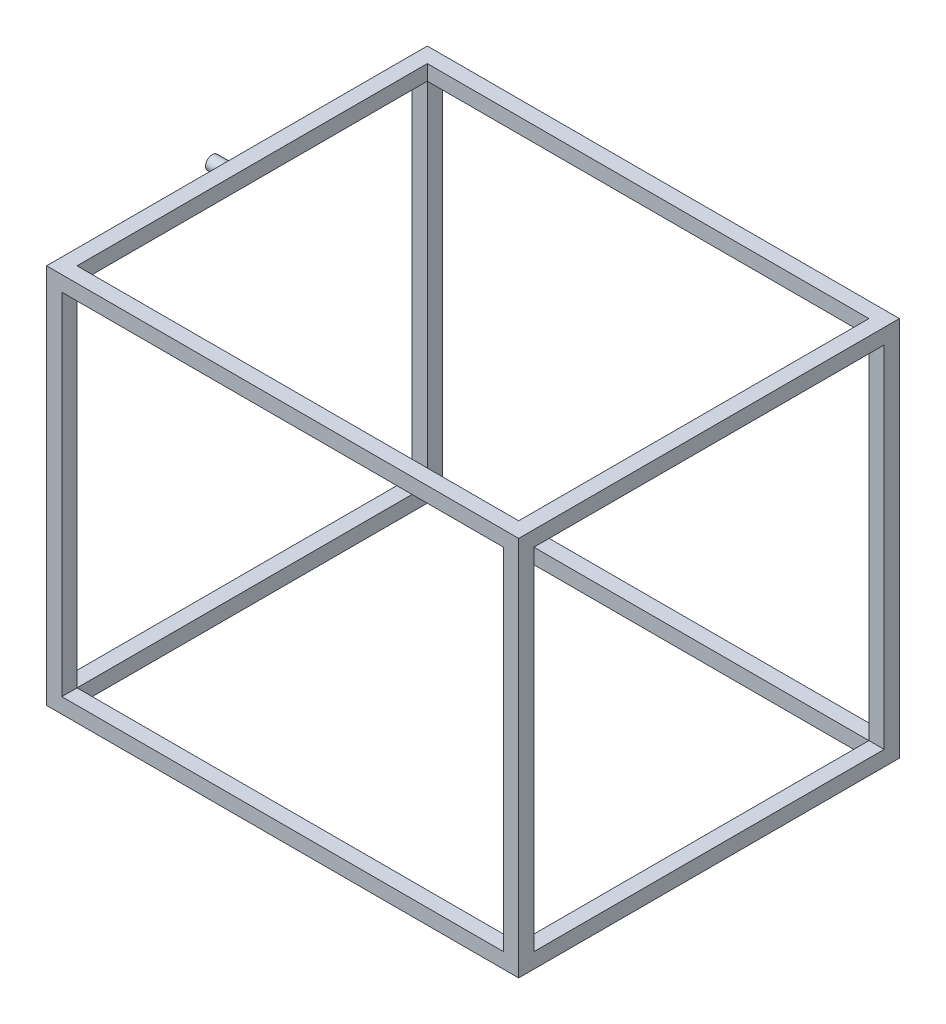
ISO-10303-21;
HEADER;
FILE_DESCRIPTION(('STEP AP214'),'2;1');
FILE_NAME('part.step','',(''),(''),'','','');
FILE_SCHEMA(('AUTOMOTIVE_DESIGN { 1 0 10303 214 1 1 1 1 }'));
ENDSEC;
DATA;
#1=APPLICATION_CONTEXT('core data for automotive mechanical design processes');
#2=APPLICATION_PROTOCOL_DEFINITION('international standard','automotive_design',2000,#1);
#3=PRODUCT_CONTEXT('',#1,'mechanical');
#4=PRODUCT('Part','Part','',(#3));
#5=PRODUCT_RELATED_PRODUCT_CATEGORY('part','',(#4));
#6=PRODUCT_DEFINITION_FORMATION('','',#4);
#7=PRODUCT_DEFINITION_CONTEXT('part definition',#1,'design');
#8=PRODUCT_DEFINITION('design','',#6,#7);
#9=PRODUCT_DEFINITION_SHAPE('','',#8);
#10=(LENGTH_UNIT() NAMED_UNIT(*) SI_UNIT(.MILLI.,.METRE.));
#11=(NAMED_UNIT(*) PLANE_ANGLE_UNIT() SI_UNIT($,.RADIAN.));
#12=(NAMED_UNIT(*) SI_UNIT($,.STERADIAN.) SOLID_ANGLE_UNIT());
#13=UNCERTAINTY_MEASURE_WITH_UNIT(LENGTH_MEASURE(1.E-05),#10,'distance_accuracy_value','');
#14=(GEOMETRIC_REPRESENTATION_CONTEXT(3) GLOBAL_UNCERTAINTY_ASSIGNED_CONTEXT((#13)) GLOBAL_UNIT_ASSIGNED_CONTEXT((#10,
#11,#12)) REPRESENTATION_CONTEXT('',''));
#15=CARTESIAN_POINT('',(0.,0.,0.));
#16=DIRECTION('',(0.,0.,1.));
#17=DIRECTION('',(1.,0.,0.));
#18=AXIS2_PLACEMENT_3D('',#15,#16,#17);
#19=CARTESIAN_POINT('',(0.,0.,500.));
#20=DIRECTION('',(0.,-1.,0.));
#21=DIRECTION('',(0.,0.,-1.));
#22=AXIS2_PLACEMENT_3D('',#19,#20,#21);
#23=PLANE('',#22);
#24=DIRECTION('',(1.,0.,0.));
#25=VECTOR('',#24,1.);
#26=CARTESIAN_POINT('',(-600.,0.,20.0000000000001));
#27=LINE('',#26,#25);
#28=CARTESIAN_POINT('',(-600.,0.,20.0000000000001));
#29=VERTEX_POINT('',#28);
#30=CARTESIAN_POINT('',(-580.,0.,20.));
#31=VERTEX_POINT('',#30);
#32=EDGE_CURVE('E216',#29,#31,#27,.T.);
#33=ORIENTED_EDGE('',*,*,#32,.F.);
#34=DIRECTION('',(0.,0.,-1.));
#35=VECTOR('',#34,1.);
#36=CARTESIAN_POINT('',(-600.,0.,0.));
#37=LINE('',#36,#35);
#38=CARTESIAN_POINT('',(-600.,0.,480.));
#39=VERTEX_POINT('',#38);
#40=EDGE_CURVE('E286',#39,#29,#37,.T.);
#41=ORIENTED_EDGE('',*,*,#40,.F.);
#42=DIRECTION('',(-1.,0.,0.));
#43=VECTOR('',#42,1.);
#44=CARTESIAN_POINT('',(-600.,0.,480.));
#45=LINE('',#44,#43);
#46=CARTESIAN_POINT('',(-580.,0.,480.));
#47=VERTEX_POINT('',#46);
#48=EDGE_CURVE('E229',#47,#39,#45,.T.);
#49=ORIENTED_EDGE('',*,*,#48,.F.);
#50=DIRECTION('',(0.,0.,-1.));
#51=VECTOR('',#50,1.);
#52=CARTESIAN_POINT('',(-580.,0.,0.));
#53=LINE('',#52,#51);
#54=EDGE_CURVE('E281',#47,#31,#53,.T.);
#55=ORIENTED_EDGE('',*,*,#54,.T.);
#56=EDGE_LOOP('',(#33,#41,#49,#55));
#57=FACE_BOUND('',#56,.T.);
#58=ADVANCED_FACE('F35',(#57),#23,.F.);
#59=DIRECTION('',(0.,0.,-1.));
#60=VECTOR('',#59,1.);
#61=CARTESIAN_POINT('',(-580.,0.,20.));
#62=LINE('',#61,#60);
#63=CARTESIAN_POINT('',(-580.,0.,0.));
#64=VERTEX_POINT('',#63);
#65=EDGE_CURVE('E212',#31,#64,#62,.T.);
#66=ORIENTED_EDGE('',*,*,#65,.F.);
#67=DIRECTION('',(1.,0.,0.));
#68=VECTOR('',#67,1.);
#69=CARTESIAN_POINT('',(-580.,0.,20.));
#70=LINE('',#69,#68);
#71=CARTESIAN_POINT('',(0.,0.,20.0000000000001));
#72=VERTEX_POINT('',#71);
#73=EDGE_CURVE('E296',#31,#72,#70,.T.);
#74=ORIENTED_EDGE('',*,*,#73,.T.);
#75=DIRECTION('',(0.,0.,1.));
#76=VECTOR('',#75,1.);
#77=CARTESIAN_POINT('',(0.,0.,0.));
#78=LINE('',#77,#76);
#79=CARTESIAN_POINT('',(0.,0.,0.));
#80=VERTEX_POINT('',#79);
#81=EDGE_CURVE('E255',#80,#72,#78,.T.);
#82=ORIENTED_EDGE('',*,*,#81,.F.);
#83=DIRECTION('',(-1.,0.,0.));
#84=VECTOR('',#83,1.);
#85=CARTESIAN_POINT('',(0.,0.,0.));
#86=LINE('',#85,#84);
#87=EDGE_CURVE('E320',#80,#64,#86,.T.);
#88=ORIENTED_EDGE('',*,*,#87,.T.);
#89=EDGE_LOOP('',(#66,#74,#82,#88));
#90=FACE_BOUND('',#89,.T.);
#91=ADVANCED_FACE('F406',(#90),#23,.F.);
#92=DIRECTION('',(0.,0.,-1.));
#93=VECTOR('',#92,1.);
#94=CARTESIAN_POINT('',(-580.,0.,480.));
#95=LINE('',#94,#93);
#96=CARTESIAN_POINT('',(-580.,0.,500.));
#97=VERTEX_POINT('',#96);
#98=EDGE_CURVE('E225',#97,#47,#95,.T.);
#99=ORIENTED_EDGE('',*,*,#98,.F.);
#100=DIRECTION('',(-1.,0.,0.));
#101=VECTOR('',#100,1.);
#102=CARTESIAN_POINT('',(0.,0.,500.));
#103=LINE('',#102,#101);
#104=CARTESIAN_POINT('',(0.,0.,500.));
#105=VERTEX_POINT('',#104);
#106=EDGE_CURVE('E322',#105,#97,#103,.T.);
#107=ORIENTED_EDGE('',*,*,#106,.F.);
#108=DIRECTION('',(0.,0.,1.));
#109=VECTOR('',#108,1.);
#110=CARTESIAN_POINT('',(0.,0.,500.));
#111=LINE('',#110,#109);
#112=CARTESIAN_POINT('',(0.,0.,480.));
#113=VERTEX_POINT('',#112);
#114=EDGE_CURVE('E244',#113,#105,#111,.T.);
#115=ORIENTED_EDGE('',*,*,#114,.F.);
#116=DIRECTION('',(1.,0.,0.));
#117=VECTOR('',#116,1.);
#118=CARTESIAN_POINT('',(-580.,0.,480.));
#119=LINE('',#118,#117);
#120=EDGE_CURVE('E313',#47,#113,#119,.T.);
#121=ORIENTED_EDGE('',*,*,#120,.F.);
#122=EDGE_LOOP('',(#99,#107,#115,#121));
#123=FACE_BOUND('',#122,.T.);
#124=ADVANCED_FACE('F413',(#123),#23,.F.);
#125=DIRECTION('',(-1.,0.,0.));
#126=VECTOR('',#125,1.);
#127=CARTESIAN_POINT('',(0.,0.,480.));
#128=LINE('',#127,#126);
#129=CARTESIAN_POINT('',(20.,0.,480.));
#130=VERTEX_POINT('',#129);
#131=EDGE_CURVE('E239',#130,#113,#128,.T.);
#132=ORIENTED_EDGE('',*,*,#131,.F.);
#133=DIRECTION('',(0.,0.,-1.));
#134=VECTOR('',#133,1.);
#135=CARTESIAN_POINT('',(20.,0.,500.));
#136=LINE('',#135,#134);
#137=CARTESIAN_POINT('',(20.,0.,20.0000000000001));
#138=VERTEX_POINT('',#137);
#139=EDGE_CURVE('E332',#130,#138,#136,.T.);
#140=ORIENTED_EDGE('',*,*,#139,.T.);
#141=DIRECTION('',(1.,0.,0.));
#142=VECTOR('',#141,1.);
#143=CARTESIAN_POINT('',(0.,0.,20.0000000000001));
#144=LINE('',#143,#142);
#145=EDGE_CURVE('E260',#72,#138,#144,.T.);
#146=ORIENTED_EDGE('',*,*,#145,.F.);
#147=DIRECTION('',(0.,0.,-1.));
#148=VECTOR('',#147,1.);
#149=CARTESIAN_POINT('',(0.,0.,500.));
#150=LINE('',#149,#148);
#151=EDGE_CURVE('E324',#113,#72,#150,.T.);
#152=ORIENTED_EDGE('',*,*,#151,.F.);
#153=EDGE_LOOP('',(#132,#140,#146,#152));
#154=FACE_BOUND('',#153,.T.);
#155=ADVANCED_FACE('F409',(#154),#23,.F.);
#156=CARTESIAN_POINT('',(0.,0.,500.));
#157=DIRECTION('',(1.,0.,0.));
#158=DIRECTION('',(0.,1.,0.));
#159=AXIS2_PLACEMENT_3D('',#156,#157,#158);
#160=PLANE('',#159);
#161=DIRECTION('',(0.,1.,0.));
#162=VECTOR('',#161,1.);
#163=CARTESIAN_POINT('',(0.,0.,20.));
#164=LINE('',#163,#162);
#165=CARTESIAN_POINT('',(0.,-20.,20.0000000000001));
#166=VERTEX_POINT('',#165);
#167=EDGE_CURVE('E288',#166,#72,#164,.T.);
#168=ORIENTED_EDGE('',*,*,#167,.F.);
#169=DIRECTION('',(0.,0.,-1.));
#170=VECTOR('',#169,1.);
#171=CARTESIAN_POINT('',(0.,-20.,500.));
#172=LINE('',#171,#170);
#173=CARTESIAN_POINT('',(0.,-20.,480.));
#174=VERTEX_POINT('',#173);
#175=EDGE_CURVE('E11',#174,#166,#172,.T.);
#176=ORIENTED_EDGE('',*,*,#175,.F.);
#177=DIRECTION('',(0.,-1.,0.));
#178=VECTOR('',#177,1.);
#179=CARTESIAN_POINT('',(0.,0.,480.));
#180=LINE('',#179,#178);
#181=EDGE_CURVE('E304',#113,#174,#180,.T.);
#182=ORIENTED_EDGE('',*,*,#181,.F.);
#183=ORIENTED_EDGE('',*,*,#151,.T.);
#184=EDGE_LOOP('',(#168,#176,#182,#183));
#185=FACE_BOUND('',#184,.T.);
#186=ADVANCED_FACE('F37',(#185),#160,.F.);
#187=CARTESIAN_POINT('',(0.,-20.,500.));
#188=DIRECTION('',(0.,1.,0.));
#189=DIRECTION('',(0.,0.,1.));
#190=AXIS2_PLACEMENT_3D('',#187,#188,#189);
#191=PLANE('',#190);
#192=DIRECTION('',(1.,0.,0.));
#193=VECTOR('',#192,1.);
#194=CARTESIAN_POINT('',(0.,-20.,500.));
#195=LINE('',#194,#193);
#196=CARTESIAN_POINT('',(-600.,-20.0000000000001,500.));
#197=VERTEX_POINT('',#196);
#198=CARTESIAN_POINT('',(20.,-20.,500.));
#199=VERTEX_POINT('',#198);
#200=EDGE_CURVE('E317',#197,#199,#195,.T.);
#201=ORIENTED_EDGE('',*,*,#200,.F.);
#202=DIRECTION('',(0.,0.,1.));
#203=VECTOR('',#202,1.);
#204=CARTESIAN_POINT('',(-600.,-20.0000000000001,500.));
#205=LINE('',#204,#203);
#206=CARTESIAN_POINT('',(-600.,-20.0000000000001,0.));
#207=VERTEX_POINT('',#206);
#208=EDGE_CURVE('E280',#207,#197,#205,.T.);
#209=ORIENTED_EDGE('',*,*,#208,.F.);
#210=DIRECTION('',(1.,0.,0.));
#211=VECTOR('',#210,1.);
#212=CARTESIAN_POINT('',(0.,-20.,0.));
#213=LINE('',#212,#211);
#214=CARTESIAN_POINT('',(20.,-20.,0.));
#215=VERTEX_POINT('',#214);
#216=EDGE_CURVE('E316',#207,#215,#213,.T.);
#217=ORIENTED_EDGE('',*,*,#216,.T.);
#218=DIRECTION('',(0.,0.,-1.));
#219=VECTOR('',#218,1.);
#220=CARTESIAN_POINT('',(20.,-20.,500.));
#221=LINE('',#220,#219);
#222=EDGE_CURVE('E43',#199,#215,#221,.T.);
#223=ORIENTED_EDGE('',*,*,#222,.F.);
#224=EDGE_LOOP('',(#201,#209,#217,#223));
#225=FACE_BOUND('',#224,.T.);
#226=DIRECTION('',(0.,0.,1.));
#227=VECTOR('',#226,1.);
#228=CARTESIAN_POINT('',(-580.,-20.0000000000001,500.));
#229=LINE('',#228,#227);
#230=CARTESIAN_POINT('',(-580.,-20.0000000000001,20.));
#231=VERTEX_POINT('',#230);
#232=CARTESIAN_POINT('',(-580.,-20.0000000000001,480.));
#233=VERTEX_POINT('',#232);
#234=EDGE_CURVE('E276',#231,#233,#229,.T.);
#235=ORIENTED_EDGE('',*,*,#234,.T.);
#236=DIRECTION('',(1.,0.,0.));
#237=VECTOR('',#236,1.);
#238=CARTESIAN_POINT('',(-580.,-20.0000000000001,480.));
#239=LINE('',#238,#237);
#240=EDGE_CURVE('E308',#233,#174,#239,.T.);
#241=ORIENTED_EDGE('',*,*,#240,.T.);
#242=ORIENTED_EDGE('',*,*,#175,.T.);
#243=DIRECTION('',(1.,0.,0.));
#244=VECTOR('',#243,1.);
#245=CARTESIAN_POINT('',(-580.,-20.0000000000001,20.));
#246=LINE('',#245,#244);
#247=EDGE_CURVE('E301',#231,#166,#246,.T.);
#248=ORIENTED_EDGE('',*,*,#247,.F.);
#249=EDGE_LOOP('',(#235,#241,#242,#248));
#250=FACE_BOUND('',#249,.T.);
#251=ADVANCED_FACE('F424',(#225,#250),#191,.F.);
#252=CARTESIAN_POINT('',(20.,0.,500.));
#253=DIRECTION('',(-1.,0.,0.));
#254=DIRECTION('',(0.,0.,1.));
#255=AXIS2_PLACEMENT_3D('',#252,#253,#254);
#256=PLANE('',#255);
#257=DIRECTION('',(0.,1.,0.));
#258=VECTOR('',#257,1.);
#259=CARTESIAN_POINT('',(20.,0.,0.));
#260=LINE('',#259,#258);
#261=CARTESIAN_POINT('',(20.,480.,0.));
#262=VERTEX_POINT('',#261);
#263=EDGE_CURVE('E326',#215,#262,#260,.T.);
#264=ORIENTED_EDGE('',*,*,#263,.T.);
#265=DIRECTION('',(0.,0.,-1.));
#266=VECTOR('',#265,1.);
#267=CARTESIAN_POINT('',(20.,480.,0.));
#268=LINE('',#267,#266);
#269=CARTESIAN_POINT('',(20.,480.,500.));
#270=VERTEX_POINT('',#269);
#271=EDGE_CURVE('E351',#270,#262,#268,.T.);
#272=ORIENTED_EDGE('',*,*,#271,.F.);
#273=DIRECTION('',(0.,1.,0.));
#274=VECTOR('',#273,1.);
#275=CARTESIAN_POINT('',(20.,0.,500.));
#276=LINE('',#275,#274);
#277=EDGE_CURVE('E319',#199,#270,#276,.T.);
#278=ORIENTED_EDGE('',*,*,#277,.F.);
#279=ORIENTED_EDGE('',*,*,#222,.T.);
#280=EDGE_LOOP('',(#264,#272,#278,#279));
#281=FACE_BOUND('',#280,.T.);
#282=DIRECTION('',(0.,0.,-1.));
#283=VECTOR('',#282,1.);
#284=CARTESIAN_POINT('',(20.,460.,0.));
#285=LINE('',#284,#283);
#286=CARTESIAN_POINT('',(20.,460.,480.));
#287=VERTEX_POINT('',#286);
#288=CARTESIAN_POINT('',(20.,460.,20.0000000000001));
#289=VERTEX_POINT('',#288);
#290=EDGE_CURVE('E202',#287,#289,#285,.T.);
#291=ORIENTED_EDGE('',*,*,#290,.T.);
#292=DIRECTION('',(0.,-1.,0.));
#293=VECTOR('',#292,1.);
#294=CARTESIAN_POINT('',(20.,460.,20.0000000000001));
#295=LINE('',#294,#293);
#296=EDGE_CURVE('E270',#289,#138,#295,.T.);
#297=ORIENTED_EDGE('',*,*,#296,.T.);
#298=ORIENTED_EDGE('',*,*,#139,.F.);
#299=DIRECTION('',(0.,-1.,0.));
#300=VECTOR('',#299,1.);
#301=CARTESIAN_POINT('',(20.,460.,480.));
#302=LINE('',#301,#300);
#303=EDGE_CURVE('E253',#287,#130,#302,.T.);
#304=ORIENTED_EDGE('',*,*,#303,.F.);
#305=EDGE_LOOP('',(#291,#297,#298,#304));
#306=FACE_BOUND('',#305,.T.);
#307=ADVANCED_FACE('F338',(#281,#306),#256,.F.);
#308=CARTESIAN_POINT('',(0.,0.,500.));
#309=DIRECTION('',(0.,0.,1.));
#310=DIRECTION('',(1.,0.,0.));
#311=AXIS2_PLACEMENT_3D('',#308,#309,#310);
#312=PLANE('',#311);
#313=ORIENTED_EDGE('',*,*,#277,.T.);
#314=DIRECTION('',(1.,0.,0.));
#315=VECTOR('',#314,1.);
#316=CARTESIAN_POINT('',(20.,480.,500.));
#317=LINE('',#316,#315);
#318=CARTESIAN_POINT('',(-600.,480.,500.));
#319=VERTEX_POINT('',#318);
#320=EDGE_CURVE('E352',#319,#270,#317,.T.);
#321=ORIENTED_EDGE('',*,*,#320,.F.);
#322=DIRECTION('',(0.,1.,0.));
#323=VECTOR('',#322,1.);
#324=CARTESIAN_POINT('',(-600.,0.,500.));
#325=LINE('',#324,#323);
#326=EDGE_CURVE('E284',#197,#319,#325,.T.);
#327=ORIENTED_EDGE('',*,*,#326,.F.);
#328=ORIENTED_EDGE('',*,*,#200,.T.);
#329=EDGE_LOOP('',(#313,#321,#327,#328));
#330=FACE_BOUND('',#329,.T.);
#331=DIRECTION('',(1.,0.,0.));
#332=VECTOR('',#331,1.);
#333=CARTESIAN_POINT('',(20.,460.,500.));
#334=LINE('',#333,#332);
#335=CARTESIAN_POINT('',(-580.,460.,500.));
#336=VERTEX_POINT('',#335);
#337=CARTESIAN_POINT('',(0.,460.,500.));
#338=VERTEX_POINT('',#337);
#339=EDGE_CURVE('E185',#336,#338,#334,.T.);
#340=ORIENTED_EDGE('',*,*,#339,.T.);
#341=DIRECTION('',(0.,-1.,0.));
#342=VECTOR('',#341,1.);
#343=CARTESIAN_POINT('',(0.,460.,500.));
#344=LINE('',#343,#342);
#345=EDGE_CURVE('E58',#338,#105,#344,.T.);
#346=ORIENTED_EDGE('',*,*,#345,.T.);
#347=ORIENTED_EDGE('',*,*,#106,.T.);
#348=DIRECTION('',(0.,-1.,0.));
#349=VECTOR('',#348,1.);
#350=CARTESIAN_POINT('',(-580.,460.,500.));
#351=LINE('',#350,#349);
#352=EDGE_CURVE('E237',#336,#97,#351,.T.);
#353=ORIENTED_EDGE('',*,*,#352,.F.);
#354=EDGE_LOOP('',(#340,#346,#347,#353));
#355=FACE_BOUND('',#354,.T.);
#356=ADVANCED_FACE('F493',(#330,#355),#312,.T.);
#357=CARTESIAN_POINT('',(0.,0.,0.));
#358=DIRECTION('',(0.,0.,1.));
#359=DIRECTION('',(1.,0.,0.));
#360=AXIS2_PLACEMENT_3D('',#357,#358,#359);
#361=PLANE('',#360);
#362=DIRECTION('',(0.,-1.,0.));
#363=VECTOR('',#362,1.);
#364=CARTESIAN_POINT('',(0.,460.,0.));
#365=LINE('',#364,#363);
#366=CARTESIAN_POINT('',(0.,460.,0.));
#367=VERTEX_POINT('',#366);
#368=EDGE_CURVE('E263',#367,#80,#365,.T.);
#369=ORIENTED_EDGE('',*,*,#368,.F.);
#370=DIRECTION('',(-1.,0.,0.));
#371=VECTOR('',#370,1.);
#372=CARTESIAN_POINT('',(-600.,460.,0.));
#373=LINE('',#372,#371);
#374=CARTESIAN_POINT('',(-580.,460.,0.));
#375=VERTEX_POINT('',#374);
#376=EDGE_CURVE('E205',#367,#375,#373,.T.);
#377=ORIENTED_EDGE('',*,*,#376,.T.);
#378=DIRECTION('',(0.,-1.,0.));
#379=VECTOR('',#378,1.);
#380=CARTESIAN_POINT('',(-580.,460.,0.));
#381=LINE('',#380,#379);
#382=EDGE_CURVE('E215',#375,#64,#381,.T.);
#383=ORIENTED_EDGE('',*,*,#382,.T.);
#384=ORIENTED_EDGE('',*,*,#87,.F.);
#385=EDGE_LOOP('',(#369,#377,#383,#384));
#386=FACE_BOUND('',#385,.T.);
#387=ORIENTED_EDGE('',*,*,#216,.F.);
#388=DIRECTION('',(0.,-1.,0.));
#389=VECTOR('',#388,1.);
#390=CARTESIAN_POINT('',(-600.,-20.0000000000001,0.));
#391=LINE('',#390,#389);
#392=CARTESIAN_POINT('',(-600.,480.,0.));
#393=VERTEX_POINT('',#392);
#394=EDGE_CURVE('E277',#393,#207,#391,.T.);
#395=ORIENTED_EDGE('',*,*,#394,.F.);
#396=DIRECTION('',(-1.,0.,0.));
#397=VECTOR('',#396,1.);
#398=CARTESIAN_POINT('',(-600.,480.,0.));
#399=LINE('',#398,#397);
#400=EDGE_CURVE('E199',#262,#393,#399,.T.);
#401=ORIENTED_EDGE('',*,*,#400,.F.);
#402=ORIENTED_EDGE('',*,*,#263,.F.);
#403=EDGE_LOOP('',(#387,#395,#401,#402));
#404=FACE_BOUND('',#403,.T.);
#405=ADVANCED_FACE('F345',(#386,#404),#361,.F.);
#406=CARTESIAN_POINT('',(-580.,0.,480.));
#407=DIRECTION('',(0.,0.,1.));
#408=DIRECTION('',(1.,0.,0.));
#409=AXIS2_PLACEMENT_3D('',#406,#407,#408);
#410=PLANE('',#409);
#411=ORIENTED_EDGE('',*,*,#181,.T.);
#412=ORIENTED_EDGE('',*,*,#240,.F.);
#413=DIRECTION('',(0.,-1.,0.));
#414=VECTOR('',#413,1.);
#415=CARTESIAN_POINT('',(-580.,0.,480.));
#416=LINE('',#415,#414);
#417=EDGE_CURVE('E305',#47,#233,#416,.T.);
#418=ORIENTED_EDGE('',*,*,#417,.F.);
#419=ORIENTED_EDGE('',*,*,#120,.T.);
#420=EDGE_LOOP('',(#411,#412,#418,#419));
#421=FACE_BOUND('',#420,.T.);
#422=ADVANCED_FACE('F482',(#421),#410,.F.);
#423=CARTESIAN_POINT('',(-580.,0.,20.));
#424=DIRECTION('',(0.,0.,-1.));
#425=DIRECTION('',(0.,1.,0.));
#426=AXIS2_PLACEMENT_3D('',#423,#424,#425);
#427=PLANE('',#426);
#428=ORIENTED_EDGE('',*,*,#167,.T.);
#429=ORIENTED_EDGE('',*,*,#73,.F.);
#430=DIRECTION('',(0.,1.,0.));
#431=VECTOR('',#430,1.);
#432=CARTESIAN_POINT('',(-580.,0.,20.));
#433=LINE('',#432,#431);
#434=EDGE_CURVE('E293',#231,#31,#433,.T.);
#435=ORIENTED_EDGE('',*,*,#434,.F.);
#436=ORIENTED_EDGE('',*,*,#247,.T.);
#437=EDGE_LOOP('',(#428,#429,#435,#436));
#438=FACE_BOUND('',#437,.T.);
#439=ADVANCED_FACE('F471',(#438),#427,.F.);
#440=CARTESIAN_POINT('',(-580.,0.,0.));
#441=DIRECTION('',(1.,0.,0.));
#442=DIRECTION('',(0.,0.,-1.));
#443=AXIS2_PLACEMENT_3D('',#440,#441,#442);
#444=PLANE('',#443);
#445=ORIENTED_EDGE('',*,*,#417,.T.);
#446=ORIENTED_EDGE('',*,*,#234,.F.);
#447=ORIENTED_EDGE('',*,*,#434,.T.);
#448=ORIENTED_EDGE('',*,*,#54,.F.);
#449=EDGE_LOOP('',(#445,#446,#447,#448));
#450=FACE_BOUND('',#449,.T.);
#451=ADVANCED_FACE('F475',(#450),#444,.T.);
#452=CARTESIAN_POINT('',(-600.,0.,0.));
#453=DIRECTION('',(1.,0.,0.));
#454=DIRECTION('',(0.,0.,-1.));
#455=AXIS2_PLACEMENT_3D('',#452,#453,#454);
#456=PLANE('',#455);
#457=ORIENTED_EDGE('',*,*,#326,.T.);
#458=DIRECTION('',(0.,0.,1.));
#459=VECTOR('',#458,1.);
#460=CARTESIAN_POINT('',(-600.,480.,500.));
#461=LINE('',#460,#459);
#462=EDGE_CURVE('E208',#393,#319,#461,.T.);
#463=ORIENTED_EDGE('',*,*,#462,.F.);
#464=ORIENTED_EDGE('',*,*,#394,.T.);
#465=ORIENTED_EDGE('',*,*,#208,.T.);
#466=EDGE_LOOP('',(#457,#463,#464,#465));
#467=FACE_BOUND('',#466,.T.);
#468=DIRECTION('',(0.,0.,1.));
#469=VECTOR('',#468,1.);
#470=CARTESIAN_POINT('',(-600.,460.,500.));
#471=LINE('',#470,#469);
#472=CARTESIAN_POINT('',(-600.,460.,20.0000000000001));
#473=VERTEX_POINT('',#472);
#474=CARTESIAN_POINT('',(-600.,460.,262.359920907128));
#475=VERTEX_POINT('',#474);
#476=EDGE_CURVE('E176',#473,#475,#471,.T.);
#477=ORIENTED_EDGE('',*,*,#476,.T.);
#478=CARTESIAN_POINT('',(-600.,468.864055169814,262.359920907128));
#479=DIRECTION('',(-1.,0.,0.));
#480=DIRECTION('',(0.,0.,1.));
#481=AXIS2_PLACEMENT_3D('',#478,#479,#480);
#482=CIRCLE('',#481,8.86405516981353);
#483=EDGE_CURVE('E180',#475,#475,#482,.T.);
#484=ORIENTED_EDGE('',*,*,#483,.F.);
#485=CARTESIAN_POINT('',(-600.,460.,480.));
#486=VERTEX_POINT('',#485);
#487=EDGE_CURVE('E186',#475,#486,#471,.T.);
#488=ORIENTED_EDGE('',*,*,#487,.T.);
#489=DIRECTION('',(0.,-1.,0.));
#490=VECTOR('',#489,1.);
#491=CARTESIAN_POINT('',(-600.,460.,480.));
#492=LINE('',#491,#490);
#493=EDGE_CURVE('E50',#486,#39,#492,.T.);
#494=ORIENTED_EDGE('',*,*,#493,.T.);
#495=ORIENTED_EDGE('',*,*,#40,.T.);
#496=DIRECTION('',(0.,-1.,0.));
#497=VECTOR('',#496,1.);
#498=CARTESIAN_POINT('',(-600.,460.,20.0000000000001));
#499=LINE('',#498,#497);
#500=EDGE_CURVE('E181',#473,#29,#499,.T.);
#501=ORIENTED_EDGE('',*,*,#500,.F.);
#502=EDGE_LOOP('',(#477,#484,#488,#494,#495,#501));
#503=FACE_BOUND('',#502,.T.);
#504=ADVANCED_FACE('F178',(#467,#503),#456,.F.);
#505=CARTESIAN_POINT('',(0.,460.,0.));
#506=DIRECTION('',(1.,0.,0.));
#507=DIRECTION('',(0.,0.,-1.));
#508=AXIS2_PLACEMENT_3D('',#505,#506,#507);
#509=PLANE('',#508);
#510=ORIENTED_EDGE('',*,*,#81,.T.);
#511=DIRECTION('',(0.,-1.,0.));
#512=VECTOR('',#511,1.);
#513=CARTESIAN_POINT('',(0.,460.,20.0000000000001));
#514=LINE('',#513,#512);
#515=CARTESIAN_POINT('',(0.,460.,20.0000000000001));
#516=VERTEX_POINT('',#515);
#517=EDGE_CURVE('E273',#516,#72,#514,.T.);
#518=ORIENTED_EDGE('',*,*,#517,.F.);
#519=DIRECTION('',(0.,0.,1.));
#520=VECTOR('',#519,1.);
#521=CARTESIAN_POINT('',(0.,460.,0.));
#522=LINE('',#521,#520);
#523=EDGE_CURVE('E256',#367,#516,#522,.T.);
#524=ORIENTED_EDGE('',*,*,#523,.F.);
#525=ORIENTED_EDGE('',*,*,#368,.T.);
#526=EDGE_LOOP('',(#510,#518,#524,#525));
#527=FACE_BOUND('',#526,.T.);
#528=ADVANCED_FACE('F464',(#527),#509,.F.);
#529=CARTESIAN_POINT('',(0.,460.,20.0000000000001));
#530=DIRECTION('',(0.,0.,-1.));
#531=DIRECTION('',(-1.,0.,0.));
#532=AXIS2_PLACEMENT_3D('',#529,#530,#531);
#533=PLANE('',#532);
#534=ORIENTED_EDGE('',*,*,#145,.T.);
#535=ORIENTED_EDGE('',*,*,#296,.F.);
#536=DIRECTION('',(1.,0.,0.));
#537=VECTOR('',#536,1.);
#538=CARTESIAN_POINT('',(0.,460.,20.0000000000001));
#539=LINE('',#538,#537);
#540=EDGE_CURVE('E259',#516,#289,#539,.T.);
#541=ORIENTED_EDGE('',*,*,#540,.F.);
#542=ORIENTED_EDGE('',*,*,#517,.T.);
#543=EDGE_LOOP('',(#534,#535,#541,#542));
#544=FACE_BOUND('',#543,.T.);
#545=ADVANCED_FACE('F434',(#544),#533,.F.);
#546=CARTESIAN_POINT('',(0.,460.,480.));
#547=DIRECTION('',(0.,0.,1.));
#548=DIRECTION('',(1.,0.,0.));
#549=AXIS2_PLACEMENT_3D('',#546,#547,#548);
#550=PLANE('',#549);
#551=ORIENTED_EDGE('',*,*,#131,.T.);
#552=DIRECTION('',(0.,-1.,0.));
#553=VECTOR('',#552,1.);
#554=CARTESIAN_POINT('',(0.,460.,480.));
#555=LINE('',#554,#553);
#556=CARTESIAN_POINT('',(0.,460.,480.));
#557=VERTEX_POINT('',#556);
#558=EDGE_CURVE('E250',#557,#113,#555,.T.);
#559=ORIENTED_EDGE('',*,*,#558,.F.);
#560=DIRECTION('',(-1.,0.,0.));
#561=VECTOR('',#560,1.);
#562=CARTESIAN_POINT('',(0.,460.,480.));
#563=LINE('',#562,#561);
#564=EDGE_CURVE('E240',#287,#557,#563,.T.);
#565=ORIENTED_EDGE('',*,*,#564,.F.);
#566=ORIENTED_EDGE('',*,*,#303,.T.);
#567=EDGE_LOOP('',(#551,#559,#565,#566));
#568=FACE_BOUND('',#567,.T.);
#569=ADVANCED_FACE('F530',(#568),#550,.F.);
#570=CARTESIAN_POINT('',(0.,460.,500.));
#571=DIRECTION('',(1.,0.,0.));
#572=DIRECTION('',(0.,0.,-1.));
#573=AXIS2_PLACEMENT_3D('',#570,#571,#572);
#574=PLANE('',#573);
#575=ORIENTED_EDGE('',*,*,#114,.T.);
#576=ORIENTED_EDGE('',*,*,#345,.F.);
#577=DIRECTION('',(0.,0.,1.));
#578=VECTOR('',#577,1.);
#579=CARTESIAN_POINT('',(0.,460.,500.));
#580=LINE('',#579,#578);
#581=EDGE_CURVE('E243',#557,#338,#580,.T.);
#582=ORIENTED_EDGE('',*,*,#581,.F.);
#583=ORIENTED_EDGE('',*,*,#558,.T.);
#584=EDGE_LOOP('',(#575,#576,#582,#583));
#585=FACE_BOUND('',#584,.T.);
#586=ADVANCED_FACE('F526',(#585),#574,.F.);
#587=CARTESIAN_POINT('',(-580.,460.,480.));
#588=DIRECTION('',(-1.,0.,0.));
#589=DIRECTION('',(0.,0.,1.));
#590=AXIS2_PLACEMENT_3D('',#587,#588,#589);
#591=PLANE('',#590);
#592=ORIENTED_EDGE('',*,*,#98,.T.);
#593=DIRECTION('',(0.,-1.,0.));
#594=VECTOR('',#593,1.);
#595=CARTESIAN_POINT('',(-580.,460.,480.));
#596=LINE('',#595,#594);
#597=CARTESIAN_POINT('',(-580.,460.,480.));
#598=VERTEX_POINT('',#597);
#599=EDGE_CURVE('E234',#598,#47,#596,.T.);
#600=ORIENTED_EDGE('',*,*,#599,.F.);
#601=DIRECTION('',(0.,0.,-1.));
#602=VECTOR('',#601,1.);
#603=CARTESIAN_POINT('',(-580.,460.,480.));
#604=LINE('',#603,#602);
#605=EDGE_CURVE('E226',#336,#598,#604,.T.);
#606=ORIENTED_EDGE('',*,*,#605,.F.);
#607=ORIENTED_EDGE('',*,*,#352,.T.);
#608=EDGE_LOOP('',(#592,#600,#606,#607));
#609=FACE_BOUND('',#608,.T.);
#610=ADVANCED_FACE('F523',(#609),#591,.F.);
#611=CARTESIAN_POINT('',(-600.,460.,480.));
#612=DIRECTION('',(0.,0.,1.));
#613=DIRECTION('',(1.,0.,0.));
#614=AXIS2_PLACEMENT_3D('',#611,#612,#613);
#615=PLANE('',#614);
#616=ORIENTED_EDGE('',*,*,#48,.T.);
#617=ORIENTED_EDGE('',*,*,#493,.F.);
#618=DIRECTION('',(-1.,0.,0.));
#619=VECTOR('',#618,1.);
#620=CARTESIAN_POINT('',(-600.,460.,480.));
#621=LINE('',#620,#619);
#622=EDGE_CURVE('E192',#598,#486,#621,.T.);
#623=ORIENTED_EDGE('',*,*,#622,.F.);
#624=ORIENTED_EDGE('',*,*,#599,.T.);
#625=EDGE_LOOP('',(#616,#617,#623,#624));
#626=FACE_BOUND('',#625,.T.);
#627=ADVANCED_FACE('F519',(#626),#615,.F.);
#628=CARTESIAN_POINT('',(-600.,460.,20.0000000000001));
#629=DIRECTION('',(0.,0.,-1.));
#630=DIRECTION('',(-1.,0.,0.));
#631=AXIS2_PLACEMENT_3D('',#628,#629,#630);
#632=PLANE('',#631);
#633=ORIENTED_EDGE('',*,*,#32,.T.);
#634=DIRECTION('',(0.,-1.,0.));
#635=VECTOR('',#634,1.);
#636=CARTESIAN_POINT('',(-580.,460.,20.));
#637=LINE('',#636,#635);
#638=CARTESIAN_POINT('',(-580.,460.,20.));
#639=VERTEX_POINT('',#638);
#640=EDGE_CURVE('E221',#639,#31,#637,.T.);
#641=ORIENTED_EDGE('',*,*,#640,.F.);
#642=DIRECTION('',(1.,0.,0.));
#643=VECTOR('',#642,1.);
#644=CARTESIAN_POINT('',(-600.,460.,20.0000000000001));
#645=LINE('',#644,#643);
#646=EDGE_CURVE('E209',#473,#639,#645,.T.);
#647=ORIENTED_EDGE('',*,*,#646,.F.);
#648=ORIENTED_EDGE('',*,*,#500,.T.);
#649=EDGE_LOOP('',(#633,#641,#647,#648));
#650=FACE_BOUND('',#649,.T.);
#651=ADVANCED_FACE('F515',(#650),#632,.F.);
#652=CARTESIAN_POINT('',(-580.,460.,20.));
#653=DIRECTION('',(-1.,0.,0.));
#654=DIRECTION('',(0.,0.,1.));
#655=AXIS2_PLACEMENT_3D('',#652,#653,#654);
#656=PLANE('',#655);
#657=ORIENTED_EDGE('',*,*,#65,.T.);
#658=ORIENTED_EDGE('',*,*,#382,.F.);
#659=DIRECTION('',(0.,0.,-1.));
#660=VECTOR('',#659,1.);
#661=CARTESIAN_POINT('',(-580.,460.,20.));
#662=LINE('',#661,#660);
#663=EDGE_CURVE('E211',#639,#375,#662,.T.);
#664=ORIENTED_EDGE('',*,*,#663,.F.);
#665=ORIENTED_EDGE('',*,*,#640,.T.);
#666=EDGE_LOOP('',(#657,#658,#664,#665));
#667=FACE_BOUND('',#666,.T.);
#668=ADVANCED_FACE('F512',(#667),#656,.F.);
#669=CARTESIAN_POINT('',(0.,460.,0.));
#670=DIRECTION('',(0.,-1.,0.));
#671=DIRECTION('',(0.,0.,-1.));
#672=AXIS2_PLACEMENT_3D('',#669,#670,#671);
#673=PLANE('',#672);
#674=ORIENTED_EDGE('',*,*,#523,.T.);
#675=DIRECTION('',(-1.,0.,0.));
#676=VECTOR('',#675,1.);
#677=CARTESIAN_POINT('',(-580.,460.,20.));
#678=LINE('',#677,#676);
#679=EDGE_CURVE('E375',#516,#639,#678,.T.);
#680=ORIENTED_EDGE('',*,*,#679,.T.);
#681=ORIENTED_EDGE('',*,*,#663,.T.);
#682=ORIENTED_EDGE('',*,*,#376,.F.);
#683=EDGE_LOOP('',(#674,#680,#681,#682));
#684=FACE_BOUND('',#683,.T.);
#685=ADVANCED_FACE('F459',(#684),#673,.T.);
#686=ORIENTED_EDGE('',*,*,#540,.T.);
#687=ORIENTED_EDGE('',*,*,#290,.F.);
#688=ORIENTED_EDGE('',*,*,#564,.T.);
#689=DIRECTION('',(0.,0.,-1.));
#690=VECTOR('',#689,1.);
#691=CARTESIAN_POINT('',(0.,460.,20.0000000000001));
#692=LINE('',#691,#690);
#693=EDGE_CURVE('E366',#557,#516,#692,.T.);
#694=ORIENTED_EDGE('',*,*,#693,.T.);
#695=EDGE_LOOP('',(#686,#687,#688,#694));
#696=FACE_BOUND('',#695,.T.);
#697=ADVANCED_FACE('F437',(#696),#673,.T.);
#698=ORIENTED_EDGE('',*,*,#581,.T.);
#699=ORIENTED_EDGE('',*,*,#339,.F.);
#700=ORIENTED_EDGE('',*,*,#605,.T.);
#701=DIRECTION('',(1.,0.,0.));
#702=VECTOR('',#701,1.);
#703=CARTESIAN_POINT('',(0.,460.,480.));
#704=LINE('',#703,#702);
#705=EDGE_CURVE('E370',#598,#557,#704,.T.);
#706=ORIENTED_EDGE('',*,*,#705,.T.);
#707=EDGE_LOOP('',(#698,#699,#700,#706));
#708=FACE_BOUND('',#707,.T.);
#709=ADVANCED_FACE('F442',(#708),#673,.T.);
#710=ORIENTED_EDGE('',*,*,#622,.T.);
#711=ORIENTED_EDGE('',*,*,#487,.F.);
#712=ORIENTED_EDGE('',*,*,#476,.F.);
#713=ORIENTED_EDGE('',*,*,#646,.T.);
#714=DIRECTION('',(0.,0.,1.));
#715=VECTOR('',#714,1.);
#716=CARTESIAN_POINT('',(-580.,460.,480.));
#717=LINE('',#716,#715);
#718=EDGE_CURVE('E373',#639,#598,#717,.T.);
#719=ORIENTED_EDGE('',*,*,#718,.T.);
#720=EDGE_LOOP('',(#710,#711,#712,#713,#719));
#721=FACE_BOUND('',#720,.T.);
#722=ADVANCED_FACE('F189',(#721),#673,.T.);
#723=CARTESIAN_POINT('',(0.,480.,0.));
#724=DIRECTION('',(0.,-1.,0.));
#725=DIRECTION('',(0.,0.,-1.));
#726=AXIS2_PLACEMENT_3D('',#723,#724,#725);
#727=PLANE('',#726);
#728=ORIENTED_EDGE('',*,*,#462,.T.);
#729=ORIENTED_EDGE('',*,*,#320,.T.);
#730=ORIENTED_EDGE('',*,*,#271,.T.);
#731=ORIENTED_EDGE('',*,*,#400,.T.);
#732=EDGE_LOOP('',(#728,#729,#730,#731));
#733=FACE_BOUND('',#732,.T.);
#734=DIRECTION('',(-1.,0.,0.));
#735=VECTOR('',#734,1.);
#736=CARTESIAN_POINT('',(-580.,480.,20.));
#737=LINE('',#736,#735);
#738=CARTESIAN_POINT('',(0.,480.,20.0000000000001));
#739=VERTEX_POINT('',#738);
#740=CARTESIAN_POINT('',(-580.,480.,20.));
#741=VERTEX_POINT('',#740);
#742=EDGE_CURVE('E369',#739,#741,#737,.T.);
#743=ORIENTED_EDGE('',*,*,#742,.F.);
#744=DIRECTION('',(0.,0.,-1.));
#745=VECTOR('',#744,1.);
#746=CARTESIAN_POINT('',(0.,480.,20.0000000000001));
#747=LINE('',#746,#745);
#748=CARTESIAN_POINT('',(0.,480.,480.));
#749=VERTEX_POINT('',#748);
#750=EDGE_CURVE('E365',#749,#739,#747,.T.);
#751=ORIENTED_EDGE('',*,*,#750,.F.);
#752=DIRECTION('',(1.,0.,0.));
#753=VECTOR('',#752,1.);
#754=CARTESIAN_POINT('',(0.,480.,480.));
#755=LINE('',#754,#753);
#756=CARTESIAN_POINT('',(-580.,480.,480.));
#757=VERTEX_POINT('',#756);
#758=EDGE_CURVE('E380',#757,#749,#755,.T.);
#759=ORIENTED_EDGE('',*,*,#758,.F.);
#760=DIRECTION('',(0.,0.,1.));
#761=VECTOR('',#760,1.);
#762=CARTESIAN_POINT('',(-580.,480.,480.));
#763=LINE('',#762,#761);
#764=EDGE_CURVE('E383',#741,#757,#763,.T.);
#765=ORIENTED_EDGE('',*,*,#764,.F.);
#766=EDGE_LOOP('',(#743,#751,#759,#765));
#767=FACE_BOUND('',#766,.T.);
#768=ADVANCED_FACE('F498',(#733,#767),#727,.F.);
#769=CARTESIAN_POINT('',(-580.,480.,20.));
#770=DIRECTION('',(0.,0.,1.));
#771=DIRECTION('',(1.,0.,0.));
#772=AXIS2_PLACEMENT_3D('',#769,#770,#771);
#773=PLANE('',#772);
#774=ORIENTED_EDGE('',*,*,#679,.F.);
#775=DIRECTION('',(0.,-1.,0.));
#776=VECTOR('',#775,1.);
#777=CARTESIAN_POINT('',(0.,480.,20.0000000000001));
#778=LINE('',#777,#776);
#779=EDGE_CURVE('E362',#739,#516,#778,.T.);
#780=ORIENTED_EDGE('',*,*,#779,.F.);
#781=ORIENTED_EDGE('',*,*,#742,.T.);
#782=DIRECTION('',(0.,-1.,0.));
#783=VECTOR('',#782,1.);
#784=CARTESIAN_POINT('',(-580.,480.,20.));
#785=LINE('',#784,#783);
#786=EDGE_CURVE('E193',#741,#639,#785,.T.);
#787=ORIENTED_EDGE('',*,*,#786,.T.);
#788=EDGE_LOOP('',(#774,#780,#781,#787));
#789=FACE_BOUND('',#788,.T.);
#790=ADVANCED_FACE('F456',(#789),#773,.T.);
#791=CARTESIAN_POINT('',(-580.,480.,480.));
#792=DIRECTION('',(1.,0.,0.));
#793=DIRECTION('',(0.,0.,-1.));
#794=AXIS2_PLACEMENT_3D('',#791,#792,#793);
#795=PLANE('',#794);
#796=ORIENTED_EDGE('',*,*,#718,.F.);
#797=ORIENTED_EDGE('',*,*,#786,.F.);
#798=ORIENTED_EDGE('',*,*,#764,.T.);
#799=DIRECTION('',(0.,-1.,0.));
#800=VECTOR('',#799,1.);
#801=CARTESIAN_POINT('',(-580.,480.,480.));
#802=LINE('',#801,#800);
#803=EDGE_CURVE('E195',#757,#598,#802,.T.);
#804=ORIENTED_EDGE('',*,*,#803,.T.);
#805=EDGE_LOOP('',(#796,#797,#798,#804));
#806=FACE_BOUND('',#805,.T.);
#807=ADVANCED_FACE('F452',(#806),#795,.T.);
#808=CARTESIAN_POINT('',(0.,480.,480.));
#809=DIRECTION('',(0.,0.,-1.));
#810=DIRECTION('',(-1.,0.,0.));
#811=AXIS2_PLACEMENT_3D('',#808,#809,#810);
#812=PLANE('',#811);
#813=ORIENTED_EDGE('',*,*,#705,.F.);
#814=ORIENTED_EDGE('',*,*,#803,.F.);
#815=ORIENTED_EDGE('',*,*,#758,.T.);
#816=DIRECTION('',(0.,-1.,0.));
#817=VECTOR('',#816,1.);
#818=CARTESIAN_POINT('',(0.,480.,480.));
#819=LINE('',#818,#817);
#820=EDGE_CURVE('E359',#749,#557,#819,.T.);
#821=ORIENTED_EDGE('',*,*,#820,.T.);
#822=EDGE_LOOP('',(#813,#814,#815,#821));
#823=FACE_BOUND('',#822,.T.);
#824=ADVANCED_FACE('F402',(#823),#812,.T.);
#825=CARTESIAN_POINT('',(0.,480.,20.0000000000001));
#826=DIRECTION('',(-1.,0.,0.));
#827=DIRECTION('',(0.,0.,1.));
#828=AXIS2_PLACEMENT_3D('',#825,#826,#827);
#829=PLANE('',#828);
#830=ORIENTED_EDGE('',*,*,#693,.F.);
#831=ORIENTED_EDGE('',*,*,#820,.F.);
#832=ORIENTED_EDGE('',*,*,#750,.T.);
#833=ORIENTED_EDGE('',*,*,#779,.T.);
#834=EDGE_LOOP('',(#830,#831,#832,#833));
#835=FACE_BOUND('',#834,.T.);
#836=ADVANCED_FACE('F395',(#835),#829,.T.);
#837=CARTESIAN_POINT('',(-620.,468.864055169814,262.359920907128));
#838=DIRECTION('',(1.,0.,0.));
#839=DIRECTION('',(0.,0.,-1.));
#840=AXIS2_PLACEMENT_3D('',#837,#838,#839);
#841=CYLINDRICAL_SURFACE('',#840,8.86405516981353);
#842=CARTESIAN_POINT('',(-620.,468.864055169814,262.359920907128));
#843=DIRECTION('',(-1.,0.,0.));
#844=DIRECTION('',(0.,0.,1.));
#845=AXIS2_PLACEMENT_3D('',#842,#843,#844);
#846=CIRCLE('',#845,8.86405516981353);
#847=CARTESIAN_POINT('',(-620.,468.864055169814,271.223976076942));
#848=VERTEX_POINT('',#847);
#849=EDGE_CURVE('E378',#848,#848,#846,.T.);
#850=ORIENTED_EDGE('',*,*,#849,.F.);
#851=EDGE_LOOP('',(#850));
#852=FACE_BOUND('',#851,.T.);
#853=ORIENTED_EDGE('',*,*,#483,.T.);
#854=EDGE_LOOP('',(#853));
#855=FACE_BOUND('',#854,.T.);
#856=ADVANCED_FACE('F392',(#852,#855),#841,.T.);
#857=CARTESIAN_POINT('',(-620.,468.864055169814,262.359920907128));
#858=DIRECTION('',(-1.,0.,0.));
#859=DIRECTION('',(0.,0.,1.));
#860=AXIS2_PLACEMENT_3D('',#857,#858,#859);
#861=PLANE('',#860);
#862=ORIENTED_EDGE('',*,*,#849,.T.);
#863=EDGE_LOOP('',(#862));
#864=FACE_BOUND('',#863,.T.);
#865=ADVANCED_FACE('F390',(#864),#861,.T.);
#866=CLOSED_SHELL('',(#58,#91,#124,#155,#186,#251,#307,#356,#405,#422,#439,#451,#504,#528,#545,
#569,#586,#610,#627,#651,#668,#685,#697,#709,#722,#768,#790,#807,#824,#836,#856,#865));
#867=MANIFOLD_SOLID_BREP('B2',#866);
#868=ADVANCED_BREP_SHAPE_REPRESENTATION('',(#18,#867),#14);
#869=SHAPE_DEFINITION_REPRESENTATION(#9,#868);
ENDSEC;
END-ISO-10303-21;
